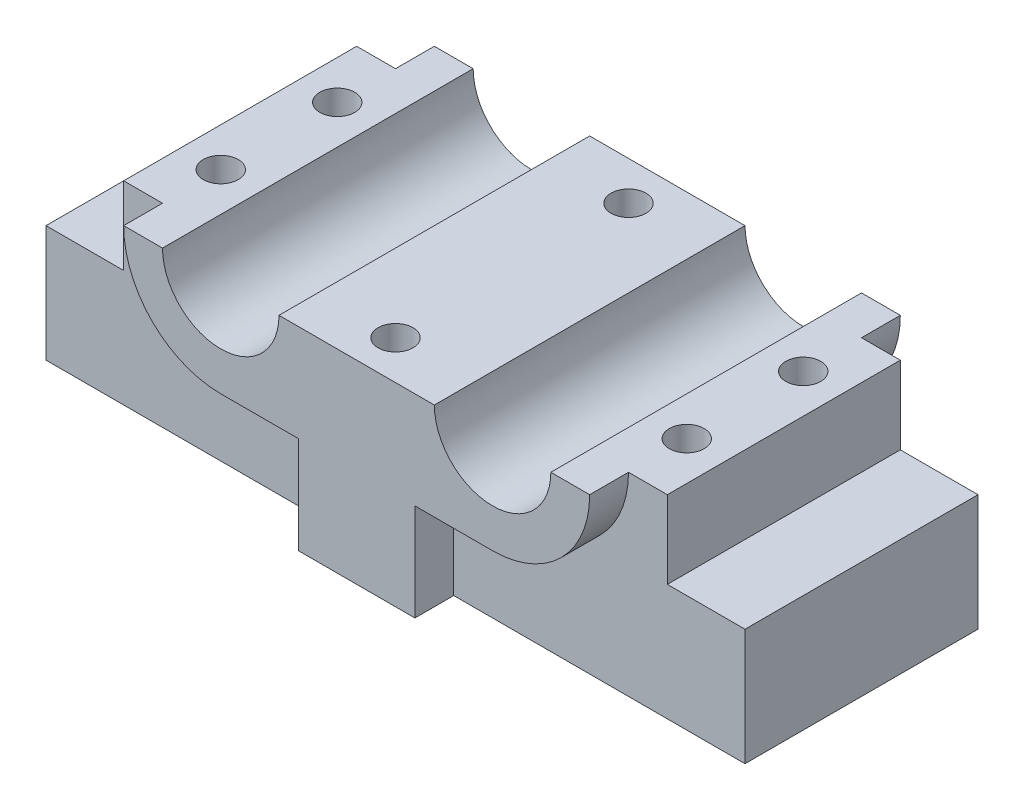
ISO-10303-21;
HEADER;
FILE_DESCRIPTION(('STEP AP214'),'2;1');
FILE_NAME('part.step','',(''),(''),'','','');
FILE_SCHEMA(('AUTOMOTIVE_DESIGN { 1 0 10303 214 1 1 1 1 }'));
ENDSEC;
DATA;
#1=APPLICATION_CONTEXT('core data for automotive mechanical design processes');
#2=APPLICATION_PROTOCOL_DEFINITION('international standard','automotive_design',2000,#1);
#3=PRODUCT_CONTEXT('',#1,'mechanical');
#4=PRODUCT('Part','Part','',(#3));
#5=PRODUCT_RELATED_PRODUCT_CATEGORY('part','',(#4));
#6=PRODUCT_DEFINITION_FORMATION('','',#4);
#7=PRODUCT_DEFINITION_CONTEXT('part definition',#1,'design');
#8=PRODUCT_DEFINITION('design','',#6,#7);
#9=PRODUCT_DEFINITION_SHAPE('','',#8);
#10=(LENGTH_UNIT() NAMED_UNIT(*) SI_UNIT(.MILLI.,.METRE.));
#11=(NAMED_UNIT(*) PLANE_ANGLE_UNIT() SI_UNIT($,.RADIAN.));
#12=(NAMED_UNIT(*) SI_UNIT($,.STERADIAN.) SOLID_ANGLE_UNIT());
#13=UNCERTAINTY_MEASURE_WITH_UNIT(LENGTH_MEASURE(1.E-05),#10,'distance_accuracy_value','');
#14=(GEOMETRIC_REPRESENTATION_CONTEXT(3) GLOBAL_UNCERTAINTY_ASSIGNED_CONTEXT((#13)) GLOBAL_UNIT_ASSIGNED_CONTEXT((#10,
#11,#12)) REPRESENTATION_CONTEXT('',''));
#15=CARTESIAN_POINT('',(0.,0.,0.));
#16=DIRECTION('',(0.,0.,1.));
#17=DIRECTION('',(1.,0.,0.));
#18=AXIS2_PLACEMENT_3D('',#15,#16,#17);
#19=CARTESIAN_POINT('',(-45.,12.5,20.));
#20=DIRECTION('',(0.,-1.,0.));
#21=DIRECTION('',(1.,0.,0.));
#22=AXIS2_PLACEMENT_3D('',#19,#20,#21);
#23=PLANE('',#22);
#24=CARTESIAN_POINT('',(-30.,12.5,-7.5));
#25=DIRECTION('',(0.,1.,0.));
#26=DIRECTION('',(0.,0.,1.));
#27=AXIS2_PLACEMENT_3D('',#24,#25,#26);
#28=CIRCLE('',#27,2.25000000000002);
#29=CARTESIAN_POINT('',(-30.,12.5,-5.24999999999998));
#30=VERTEX_POINT('',#29);
#31=EDGE_CURVE('E763',#30,#30,#28,.T.);
#32=ORIENTED_EDGE('',*,*,#31,.F.);
#33=EDGE_LOOP('',(#32));
#34=FACE_BOUND('',#33,.T.);
#35=DIRECTION('',(-1.,0.,0.));
#36=VECTOR('',#35,1.);
#37=CARTESIAN_POINT('',(-45.,12.5,20.));
#38=LINE('',#37,#36);
#39=CARTESIAN_POINT('',(-25.,12.5,20.));
#40=VERTEX_POINT('',#39);
#41=CARTESIAN_POINT('',(-30.,12.5,20.));
#42=VERTEX_POINT('',#41);
#43=EDGE_CURVE('E252',#40,#42,#38,.T.);
#44=ORIENTED_EDGE('',*,*,#43,.F.);
#45=DIRECTION('',(0.,0.,1.));
#46=VECTOR('',#45,1.);
#47=CARTESIAN_POINT('',(-25.,12.5,-20.001));
#48=LINE('',#47,#46);
#49=CARTESIAN_POINT('',(-25.,12.5,-20.));
#50=VERTEX_POINT('',#49);
#51=EDGE_CURVE('E54',#50,#40,#48,.T.);
#52=ORIENTED_EDGE('',*,*,#51,.F.);
#53=DIRECTION('',(-1.,0.,0.));
#54=VECTOR('',#53,1.);
#55=CARTESIAN_POINT('',(-45.,12.5,-20.));
#56=LINE('',#55,#54);
#57=CARTESIAN_POINT('',(-30.,12.5,-20.));
#58=VERTEX_POINT('',#57);
#59=EDGE_CURVE('E250',#50,#58,#56,.T.);
#60=ORIENTED_EDGE('',*,*,#59,.T.);
#61=DIRECTION('',(0.,0.,-1.));
#62=VECTOR('',#61,1.);
#63=CARTESIAN_POINT('',(-30.,12.5,-15.));
#64=LINE('',#63,#62);
#65=CARTESIAN_POINT('',(-30.,12.5,-15.));
#66=VERTEX_POINT('',#65);
#67=EDGE_CURVE('E354',#66,#58,#64,.T.);
#68=ORIENTED_EDGE('',*,*,#67,.F.);
#69=DIRECTION('',(-1.,0.,0.));
#70=VECTOR('',#69,1.);
#71=CARTESIAN_POINT('',(-35.,12.5,-15.));
#72=LINE('',#71,#70);
#73=CARTESIAN_POINT('',(-35.,12.5,-15.));
#74=VERTEX_POINT('',#73);
#75=EDGE_CURVE('E339',#66,#74,#72,.T.);
#76=ORIENTED_EDGE('',*,*,#75,.T.);
#77=DIRECTION('',(0.,0.,1.));
#78=VECTOR('',#77,1.);
#79=CARTESIAN_POINT('',(-35.,12.5,-20.));
#80=LINE('',#79,#78);
#81=CARTESIAN_POINT('',(-35.,12.5,15.));
#82=VERTEX_POINT('',#81);
#83=EDGE_CURVE('E274',#74,#82,#80,.T.);
#84=ORIENTED_EDGE('',*,*,#83,.T.);
#85=DIRECTION('',(-1.,0.,0.));
#86=VECTOR('',#85,1.);
#87=CARTESIAN_POINT('',(-35.,12.5,15.));
#88=LINE('',#87,#86);
#89=CARTESIAN_POINT('',(-30.,12.5,15.));
#90=VERTEX_POINT('',#89);
#91=EDGE_CURVE('E425',#90,#82,#88,.T.);
#92=ORIENTED_EDGE('',*,*,#91,.F.);
#93=DIRECTION('',(0.,0.,1.));
#94=VECTOR('',#93,1.);
#95=CARTESIAN_POINT('',(-30.,12.5,15.));
#96=LINE('',#95,#94);
#97=EDGE_CURVE('E327',#90,#42,#96,.T.);
#98=ORIENTED_EDGE('',*,*,#97,.T.);
#99=EDGE_LOOP('',(#44,#52,#60,#68,#76,#84,#92,#98));
#100=FACE_BOUND('',#99,.T.);
#101=CARTESIAN_POINT('',(-30.,12.5,7.5));
#102=DIRECTION('',(0.,1.,0.));
#103=DIRECTION('',(0.,0.,1.));
#104=AXIS2_PLACEMENT_3D('',#101,#102,#103);
#105=CIRCLE('',#104,2.25000000000002);
#106=CARTESIAN_POINT('',(-30.,12.5,9.75000000000002));
#107=VERTEX_POINT('',#106);
#108=EDGE_CURVE('E767',#107,#107,#105,.T.);
#109=ORIENTED_EDGE('',*,*,#108,.F.);
#110=EDGE_LOOP('',(#109));
#111=FACE_BOUND('',#110,.T.);
#112=ADVANCED_FACE('F39',(#34,#100,#111),#23,.F.);
#113=CARTESIAN_POINT('',(30.,12.5,-20.));
#114=VERTEX_POINT('',#113);
#115=CARTESIAN_POINT('',(25.,12.5,-20.));
#116=VERTEX_POINT('',#115);
#117=EDGE_CURVE('E237',#114,#116,#56,.T.);
#118=ORIENTED_EDGE('',*,*,#117,.T.);
#119=DIRECTION('',(0.,0.,1.));
#120=VECTOR('',#119,1.);
#121=CARTESIAN_POINT('',(25.,12.5,-20.001));
#122=LINE('',#121,#120);
#123=CARTESIAN_POINT('',(25.,12.5,20.));
#124=VERTEX_POINT('',#123);
#125=EDGE_CURVE('E222',#116,#124,#122,.T.);
#126=ORIENTED_EDGE('',*,*,#125,.T.);
#127=CARTESIAN_POINT('',(30.,12.5,20.));
#128=VERTEX_POINT('',#127);
#129=EDGE_CURVE('E281',#128,#124,#38,.T.);
#130=ORIENTED_EDGE('',*,*,#129,.F.);
#131=DIRECTION('',(0.,0.,1.));
#132=VECTOR('',#131,1.);
#133=CARTESIAN_POINT('',(30.,12.5,15.));
#134=LINE('',#133,#132);
#135=CARTESIAN_POINT('',(30.,12.5,15.));
#136=VERTEX_POINT('',#135);
#137=EDGE_CURVE('E280',#136,#128,#134,.T.);
#138=ORIENTED_EDGE('',*,*,#137,.F.);
#139=DIRECTION('',(-1.,0.,0.));
#140=VECTOR('',#139,1.);
#141=CARTESIAN_POINT('',(35.,12.5,15.));
#142=LINE('',#141,#140);
#143=CARTESIAN_POINT('',(35.,12.5,15.));
#144=VERTEX_POINT('',#143);
#145=EDGE_CURVE('E388',#144,#136,#142,.T.);
#146=ORIENTED_EDGE('',*,*,#145,.F.);
#147=DIRECTION('',(0.,0.,1.));
#148=VECTOR('',#147,1.);
#149=CARTESIAN_POINT('',(35.,12.5,-20.));
#150=LINE('',#149,#148);
#151=CARTESIAN_POINT('',(35.,12.5,-15.));
#152=VERTEX_POINT('',#151);
#153=EDGE_CURVE('E267',#152,#144,#150,.T.);
#154=ORIENTED_EDGE('',*,*,#153,.F.);
#155=DIRECTION('',(-1.,0.,0.));
#156=VECTOR('',#155,1.);
#157=CARTESIAN_POINT('',(35.,12.5,-15.));
#158=LINE('',#157,#156);
#159=CARTESIAN_POINT('',(30.,12.5,-15.));
#160=VERTEX_POINT('',#159);
#161=EDGE_CURVE('E497',#152,#160,#158,.T.);
#162=ORIENTED_EDGE('',*,*,#161,.T.);
#163=DIRECTION('',(0.,0.,-1.));
#164=VECTOR('',#163,1.);
#165=CARTESIAN_POINT('',(30.,12.5,-15.));
#166=LINE('',#165,#164);
#167=EDGE_CURVE('E247',#160,#114,#166,.T.);
#168=ORIENTED_EDGE('',*,*,#167,.T.);
#169=EDGE_LOOP('',(#118,#126,#130,#138,#146,#154,#162,#168));
#170=FACE_BOUND('',#169,.T.);
#171=CARTESIAN_POINT('',(30.,12.5,7.5));
#172=DIRECTION('',(0.,1.,0.));
#173=DIRECTION('',(0.,0.,1.));
#174=AXIS2_PLACEMENT_3D('',#171,#172,#173);
#175=CIRCLE('',#174,2.25000000000002);
#176=CARTESIAN_POINT('',(30.,12.5,9.75000000000002));
#177=VERTEX_POINT('',#176);
#178=EDGE_CURVE('E621',#177,#177,#175,.T.);
#179=ORIENTED_EDGE('',*,*,#178,.F.);
#180=EDGE_LOOP('',(#179));
#181=FACE_BOUND('',#180,.T.);
#182=CARTESIAN_POINT('',(30.,12.5,-7.5));
#183=DIRECTION('',(0.,1.,0.));
#184=DIRECTION('',(0.,0.,1.));
#185=AXIS2_PLACEMENT_3D('',#182,#183,#184);
#186=CIRCLE('',#185,2.25000000000001);
#187=CARTESIAN_POINT('',(30.,12.5,-5.24999999999999));
#188=VERTEX_POINT('',#187);
#189=EDGE_CURVE('E771',#188,#188,#186,.T.);
#190=ORIENTED_EDGE('',*,*,#189,.F.);
#191=EDGE_LOOP('',(#190));
#192=FACE_BOUND('',#191,.T.);
#193=ADVANCED_FACE('F244',(#170,#181,#192),#23,.F.);
#194=CARTESIAN_POINT('',(0.,12.5,-15.));
#195=DIRECTION('',(0.,1.,0.));
#196=DIRECTION('',(0.,0.,1.));
#197=AXIS2_PLACEMENT_3D('',#194,#195,#196);
#198=CIRCLE('',#197,2.25000000000001);
#199=CARTESIAN_POINT('',(0.,12.5,-12.75));
#200=VERTEX_POINT('',#199);
#201=EDGE_CURVE('E528',#200,#200,#198,.T.);
#202=ORIENTED_EDGE('',*,*,#201,.F.);
#203=EDGE_LOOP('',(#202));
#204=FACE_BOUND('',#203,.T.);
#205=CARTESIAN_POINT('',(0.,12.5,15.));
#206=DIRECTION('',(0.,1.,0.));
#207=DIRECTION('',(0.,0.,1.));
#208=AXIS2_PLACEMENT_3D('',#205,#206,#207);
#209=CIRCLE('',#208,2.25000000000001);
#210=CARTESIAN_POINT('',(0.,12.5,17.25));
#211=VERTEX_POINT('',#210);
#212=EDGE_CURVE('E532',#211,#211,#209,.T.);
#213=ORIENTED_EDGE('',*,*,#212,.F.);
#214=EDGE_LOOP('',(#213));
#215=FACE_BOUND('',#214,.T.);
#216=CARTESIAN_POINT('',(9.99999999999999,12.5,20.));
#217=VERTEX_POINT('',#216);
#218=CARTESIAN_POINT('',(-10.,12.5,20.));
#219=VERTEX_POINT('',#218);
#220=EDGE_CURVE('E283',#217,#219,#38,.T.);
#221=ORIENTED_EDGE('',*,*,#220,.F.);
#222=DIRECTION('',(0.,0.,1.));
#223=VECTOR('',#222,1.);
#224=CARTESIAN_POINT('',(10.,12.5,-20.001));
#225=LINE('',#224,#223);
#226=CARTESIAN_POINT('',(10.,12.5,-20.));
#227=VERTEX_POINT('',#226);
#228=EDGE_CURVE('E62',#227,#217,#225,.T.);
#229=ORIENTED_EDGE('',*,*,#228,.F.);
#230=CARTESIAN_POINT('',(-10.,12.5,-20.));
#231=VERTEX_POINT('',#230);
#232=EDGE_CURVE('E240',#227,#231,#56,.T.);
#233=ORIENTED_EDGE('',*,*,#232,.T.);
#234=DIRECTION('',(0.,0.,1.));
#235=VECTOR('',#234,1.);
#236=CARTESIAN_POINT('',(-10.,12.5,-20.001));
#237=LINE('',#236,#235);
#238=EDGE_CURVE('E536',#231,#219,#237,.T.);
#239=ORIENTED_EDGE('',*,*,#238,.T.);
#240=EDGE_LOOP('',(#221,#229,#233,#239));
#241=FACE_BOUND('',#240,.T.);
#242=ADVANCED_FACE('F511',(#204,#215,#241),#23,.F.);
#243=CARTESIAN_POINT('',(-45.,12.5,20.));
#244=DIRECTION('',(1.,0.,0.));
#245=DIRECTION('',(0.,0.,-1.));
#246=AXIS2_PLACEMENT_3D('',#243,#244,#245);
#247=PLANE('',#246);
#248=DIRECTION('',(0.,-1.,0.));
#249=VECTOR('',#248,1.);
#250=CARTESIAN_POINT('',(-45.,-12.5,-15.));
#251=LINE('',#250,#249);
#252=CARTESIAN_POINT('',(-45.,2.5,-15.));
#253=VERTEX_POINT('',#252);
#254=CARTESIAN_POINT('',(-45.,-12.5,-15.));
#255=VERTEX_POINT('',#254);
#256=EDGE_CURVE('E351',#253,#255,#251,.T.);
#257=ORIENTED_EDGE('',*,*,#256,.T.);
#258=DIRECTION('',(0.,0.,-1.));
#259=VECTOR('',#258,1.);
#260=CARTESIAN_POINT('',(-45.,-12.5,20.));
#261=LINE('',#260,#259);
#262=CARTESIAN_POINT('',(-45.,-12.5,15.));
#263=VERTEX_POINT('',#262);
#264=EDGE_CURVE('E11',#263,#255,#261,.T.);
#265=ORIENTED_EDGE('',*,*,#264,.F.);
#266=DIRECTION('',(0.,-1.,0.));
#267=VECTOR('',#266,1.);
#268=CARTESIAN_POINT('',(-45.,-12.5,15.));
#269=LINE('',#268,#267);
#270=CARTESIAN_POINT('',(-45.,2.5,15.));
#271=VERTEX_POINT('',#270);
#272=EDGE_CURVE('E439',#271,#263,#269,.T.);
#273=ORIENTED_EDGE('',*,*,#272,.F.);
#274=DIRECTION('',(0.,0.,1.));
#275=VECTOR('',#274,1.);
#276=CARTESIAN_POINT('',(-45.,2.49999999999999,-20.));
#277=LINE('',#276,#275);
#278=EDGE_CURVE('E276',#253,#271,#277,.T.);
#279=ORIENTED_EDGE('',*,*,#278,.F.);
#280=EDGE_LOOP('',(#257,#265,#273,#279));
#281=FACE_BOUND('',#280,.T.);
#282=ADVANCED_FACE('F452',(#281),#247,.F.);
#283=CARTESIAN_POINT('',(-35.,12.5,-20.));
#284=DIRECTION('',(1.,0.,0.));
#285=DIRECTION('',(0.,0.,-1.));
#286=AXIS2_PLACEMENT_3D('',#283,#284,#285);
#287=PLANE('',#286);
#288=DIRECTION('',(0.,-1.,0.));
#289=VECTOR('',#288,1.);
#290=CARTESIAN_POINT('',(-35.,2.5,-15.));
#291=LINE('',#290,#289);
#292=CARTESIAN_POINT('',(-35.,2.5,-15.));
#293=VERTEX_POINT('',#292);
#294=EDGE_CURVE('E335',#74,#293,#291,.T.);
#295=ORIENTED_EDGE('',*,*,#294,.T.);
#296=DIRECTION('',(0.,0.,1.));
#297=VECTOR('',#296,1.);
#298=CARTESIAN_POINT('',(-35.,2.49999999999999,-20.));
#299=LINE('',#298,#297);
#300=CARTESIAN_POINT('',(-35.,2.49999999999999,15.));
#301=VERTEX_POINT('',#300);
#302=EDGE_CURVE('E278',#293,#301,#299,.T.);
#303=ORIENTED_EDGE('',*,*,#302,.T.);
#304=DIRECTION('',(0.,-1.,0.));
#305=VECTOR('',#304,1.);
#306=CARTESIAN_POINT('',(-35.,2.5,15.));
#307=LINE('',#306,#305);
#308=EDGE_CURVE('E408',#82,#301,#307,.T.);
#309=ORIENTED_EDGE('',*,*,#308,.F.);
#310=ORIENTED_EDGE('',*,*,#83,.F.);
#311=EDGE_LOOP('',(#295,#303,#309,#310));
#312=FACE_BOUND('',#311,.T.);
#313=ADVANCED_FACE('F470',(#312),#287,.F.);
#314=CARTESIAN_POINT('',(-35.,2.49999999999999,-20.));
#315=DIRECTION('',(0.,-1.,0.));
#316=DIRECTION('',(1.,0.,0.));
#317=AXIS2_PLACEMENT_3D('',#314,#315,#316);
#318=PLANE('',#317);
#319=DIRECTION('',(-1.,0.,0.));
#320=VECTOR('',#319,1.);
#321=CARTESIAN_POINT('',(-45.,2.5,-15.));
#322=LINE('',#321,#320);
#323=EDGE_CURVE('E332',#293,#253,#322,.T.);
#324=ORIENTED_EDGE('',*,*,#323,.T.);
#325=ORIENTED_EDGE('',*,*,#278,.T.);
#326=DIRECTION('',(-1.,0.,0.));
#327=VECTOR('',#326,1.);
#328=CARTESIAN_POINT('',(-45.,2.5,15.));
#329=LINE('',#328,#327);
#330=EDGE_CURVE('E270',#301,#271,#329,.T.);
#331=ORIENTED_EDGE('',*,*,#330,.F.);
#332=ORIENTED_EDGE('',*,*,#302,.F.);
#333=EDGE_LOOP('',(#324,#325,#331,#332));
#334=FACE_BOUND('',#333,.T.);
#335=ADVANCED_FACE('F471',(#334),#318,.F.);
#336=CARTESIAN_POINT('',(-45.,-12.5,20.));
#337=DIRECTION('',(0.,1.,0.));
#338=DIRECTION('',(0.,0.,1.));
#339=AXIS2_PLACEMENT_3D('',#336,#337,#338);
#340=PLANE('',#339);
#341=CARTESIAN_POINT('',(0.,-12.5,-15.));
#342=DIRECTION('',(0.,1.,0.));
#343=DIRECTION('',(0.,0.,1.));
#344=AXIS2_PLACEMENT_3D('',#341,#342,#343);
#345=CIRCLE('',#344,2.25000000000001);
#346=CARTESIAN_POINT('',(0.,-12.5,-12.75));
#347=VERTEX_POINT('',#346);
#348=EDGE_CURVE('E601',#347,#347,#345,.T.);
#349=ORIENTED_EDGE('',*,*,#348,.T.);
#350=EDGE_LOOP('',(#349));
#351=FACE_BOUND('',#350,.T.);
#352=CARTESIAN_POINT('',(0.,-12.5,15.));
#353=DIRECTION('',(0.,1.,0.));
#354=DIRECTION('',(0.,0.,1.));
#355=AXIS2_PLACEMENT_3D('',#352,#353,#354);
#356=CIRCLE('',#355,2.25000000000001);
#357=CARTESIAN_POINT('',(0.,-12.5,17.25));
#358=VERTEX_POINT('',#357);
#359=EDGE_CURVE('E605',#358,#358,#356,.T.);
#360=ORIENTED_EDGE('',*,*,#359,.T.);
#361=EDGE_LOOP('',(#360));
#362=FACE_BOUND('',#361,.T.);
#363=CARTESIAN_POINT('',(-30.,-12.5,-7.5));
#364=DIRECTION('',(0.,1.,0.));
#365=DIRECTION('',(0.,0.,1.));
#366=AXIS2_PLACEMENT_3D('',#363,#364,#365);
#367=CIRCLE('',#366,2.25000000000001);
#368=CARTESIAN_POINT('',(-30.,-12.5,-5.24999999999999));
#369=VERTEX_POINT('',#368);
#370=EDGE_CURVE('E609',#369,#369,#367,.T.);
#371=ORIENTED_EDGE('',*,*,#370,.T.);
#372=EDGE_LOOP('',(#371));
#373=FACE_BOUND('',#372,.T.);
#374=CARTESIAN_POINT('',(-30.,-12.5,7.5));
#375=DIRECTION('',(0.,1.,0.));
#376=DIRECTION('',(0.,0.,1.));
#377=AXIS2_PLACEMENT_3D('',#374,#375,#376);
#378=CIRCLE('',#377,2.25000000000001);
#379=CARTESIAN_POINT('',(-30.,-12.5,9.75000000000001));
#380=VERTEX_POINT('',#379);
#381=EDGE_CURVE('E613',#380,#380,#378,.T.);
#382=ORIENTED_EDGE('',*,*,#381,.T.);
#383=EDGE_LOOP('',(#382));
#384=FACE_BOUND('',#383,.T.);
#385=CARTESIAN_POINT('',(30.,-12.5,-7.5));
#386=DIRECTION('',(0.,1.,0.));
#387=DIRECTION('',(0.,0.,1.));
#388=AXIS2_PLACEMENT_3D('',#385,#386,#387);
#389=CIRCLE('',#388,2.25000000000001);
#390=CARTESIAN_POINT('',(30.,-12.5,-5.24999999999999));
#391=VERTEX_POINT('',#390);
#392=EDGE_CURVE('E617',#391,#391,#389,.T.);
#393=ORIENTED_EDGE('',*,*,#392,.T.);
#394=EDGE_LOOP('',(#393));
#395=FACE_BOUND('',#394,.T.);
#396=CARTESIAN_POINT('',(30.,-12.5,7.5));
#397=DIRECTION('',(0.,1.,0.));
#398=DIRECTION('',(0.,0.,1.));
#399=AXIS2_PLACEMENT_3D('',#396,#397,#398);
#400=CIRCLE('',#399,2.25000000000001);
#401=CARTESIAN_POINT('',(30.,-12.5,9.75000000000001));
#402=VERTEX_POINT('',#401);
#403=EDGE_CURVE('E539',#402,#402,#400,.T.);
#404=ORIENTED_EDGE('',*,*,#403,.T.);
#405=EDGE_LOOP('',(#404));
#406=FACE_BOUND('',#405,.T.);
#407=DIRECTION('',(0.,0.,-1.));
#408=VECTOR('',#407,1.);
#409=CARTESIAN_POINT('',(7.5,-12.5,-15.));
#410=LINE('',#409,#408);
#411=CARTESIAN_POINT('',(7.5,-12.5,-15.));
#412=VERTEX_POINT('',#411);
#413=CARTESIAN_POINT('',(7.5,-12.5,-20.));
#414=VERTEX_POINT('',#413);
#415=EDGE_CURVE('E302',#412,#414,#410,.T.);
#416=ORIENTED_EDGE('',*,*,#415,.F.);
#417=DIRECTION('',(1.,0.,0.));
#418=VECTOR('',#417,1.);
#419=CARTESIAN_POINT('',(7.5,-12.5,-15.));
#420=LINE('',#419,#418);
#421=CARTESIAN_POINT('',(45.,-12.5,-15.));
#422=VERTEX_POINT('',#421);
#423=EDGE_CURVE('E301',#412,#422,#420,.T.);
#424=ORIENTED_EDGE('',*,*,#423,.T.);
#425=DIRECTION('',(0.,0.,-1.));
#426=VECTOR('',#425,1.);
#427=CARTESIAN_POINT('',(45.,-12.5,20.));
#428=LINE('',#427,#426);
#429=CARTESIAN_POINT('',(45.,-12.5,15.));
#430=VERTEX_POINT('',#429);
#431=EDGE_CURVE('E47',#430,#422,#428,.T.);
#432=ORIENTED_EDGE('',*,*,#431,.F.);
#433=DIRECTION('',(1.,0.,0.));
#434=VECTOR('',#433,1.);
#435=CARTESIAN_POINT('',(7.5,-12.5,15.));
#436=LINE('',#435,#434);
#437=CARTESIAN_POINT('',(7.5,-12.5,15.));
#438=VERTEX_POINT('',#437);
#439=EDGE_CURVE('E299',#438,#430,#436,.T.);
#440=ORIENTED_EDGE('',*,*,#439,.F.);
#441=DIRECTION('',(0.,0.,1.));
#442=VECTOR('',#441,1.);
#443=CARTESIAN_POINT('',(7.5,-12.5,15.));
#444=LINE('',#443,#442);
#445=CARTESIAN_POINT('',(7.5,-12.5,20.));
#446=VERTEX_POINT('',#445);
#447=EDGE_CURVE('E401',#438,#446,#444,.T.);
#448=ORIENTED_EDGE('',*,*,#447,.T.);
#449=DIRECTION('',(1.,0.,0.));
#450=VECTOR('',#449,1.);
#451=CARTESIAN_POINT('',(-45.,-12.5,20.));
#452=LINE('',#451,#450);
#453=CARTESIAN_POINT('',(-7.5,-12.5,20.));
#454=VERTEX_POINT('',#453);
#455=EDGE_CURVE('E282',#454,#446,#452,.T.);
#456=ORIENTED_EDGE('',*,*,#455,.F.);
#457=DIRECTION('',(0.,0.,1.));
#458=VECTOR('',#457,1.);
#459=CARTESIAN_POINT('',(-7.5,-12.5,15.));
#460=LINE('',#459,#458);
#461=CARTESIAN_POINT('',(-7.5,-12.5,15.));
#462=VERTEX_POINT('',#461);
#463=EDGE_CURVE('E406',#462,#454,#460,.T.);
#464=ORIENTED_EDGE('',*,*,#463,.F.);
#465=DIRECTION('',(1.,0.,0.));
#466=VECTOR('',#465,1.);
#467=CARTESIAN_POINT('',(-7.5,-12.5,15.));
#468=LINE('',#467,#466);
#469=EDGE_CURVE('E437',#263,#462,#468,.T.);
#470=ORIENTED_EDGE('',*,*,#469,.F.);
#471=ORIENTED_EDGE('',*,*,#264,.T.);
#472=DIRECTION('',(1.,0.,0.));
#473=VECTOR('',#472,1.);
#474=CARTESIAN_POINT('',(-7.5,-12.5,-15.));
#475=LINE('',#474,#473);
#476=CARTESIAN_POINT('',(-7.5,-12.5,-15.));
#477=VERTEX_POINT('',#476);
#478=EDGE_CURVE('E348',#255,#477,#475,.T.);
#479=ORIENTED_EDGE('',*,*,#478,.T.);
#480=DIRECTION('',(0.,0.,-1.));
#481=VECTOR('',#480,1.);
#482=CARTESIAN_POINT('',(-7.5,-12.5,-15.));
#483=LINE('',#482,#481);
#484=CARTESIAN_POINT('',(-7.5,-12.5,-20.));
#485=VERTEX_POINT('',#484);
#486=EDGE_CURVE('E317',#477,#485,#483,.T.);
#487=ORIENTED_EDGE('',*,*,#486,.T.);
#488=DIRECTION('',(1.,0.,0.));
#489=VECTOR('',#488,1.);
#490=CARTESIAN_POINT('',(-45.,-12.5,-20.));
#491=LINE('',#490,#489);
#492=EDGE_CURVE('E248',#485,#414,#491,.T.);
#493=ORIENTED_EDGE('',*,*,#492,.T.);
#494=EDGE_LOOP('',(#416,#424,#432,#440,#448,#456,#464,#470,#471,#479,#487,#493));
#495=FACE_BOUND('',#494,.T.);
#496=ADVANCED_FACE('F297',(#351,#362,#373,#384,#395,#406,#495),#340,.F.);
#497=CARTESIAN_POINT('',(0.,0.,-20.));
#498=DIRECTION('',(0.,0.,1.));
#499=DIRECTION('',(1.,0.,0.));
#500=AXIS2_PLACEMENT_3D('',#497,#498,#499);
#501=PLANE('',#500);
#502=ORIENTED_EDGE('',*,*,#232,.F.);
#503=CARTESIAN_POINT('',(17.5,12.5,-20.));
#504=DIRECTION('',(0.,0.,1.));
#505=DIRECTION('',(1.,0.,0.));
#506=AXIS2_PLACEMENT_3D('',#503,#504,#505);
#507=CIRCLE('',#506,7.5);
#508=EDGE_CURVE('E225',#116,#227,#507,.F.);
#509=ORIENTED_EDGE('',*,*,#508,.F.);
#510=ORIENTED_EDGE('',*,*,#117,.F.);
#511=CARTESIAN_POINT('',(17.5,12.5,-20.));
#512=DIRECTION('',(0.,0.,-1.));
#513=DIRECTION('',(-1.,0.,0.));
#514=AXIS2_PLACEMENT_3D('',#511,#512,#513);
#515=CIRCLE('',#514,12.5);
#516=CARTESIAN_POINT('',(17.5,0.,-20.));
#517=VERTEX_POINT('',#516);
#518=EDGE_CURVE('E314',#114,#517,#515,.T.);
#519=ORIENTED_EDGE('',*,*,#518,.T.);
#520=DIRECTION('',(-1.,0.,0.));
#521=VECTOR('',#520,1.);
#522=CARTESIAN_POINT('',(17.5,0.,-20.));
#523=LINE('',#522,#521);
#524=CARTESIAN_POINT('',(7.5,0.,-20.));
#525=VERTEX_POINT('',#524);
#526=EDGE_CURVE('E320',#517,#525,#523,.T.);
#527=ORIENTED_EDGE('',*,*,#526,.T.);
#528=DIRECTION('',(0.,-1.,0.));
#529=VECTOR('',#528,1.);
#530=CARTESIAN_POINT('',(7.5,0.,-20.));
#531=LINE('',#530,#529);
#532=EDGE_CURVE('E316',#525,#414,#531,.T.);
#533=ORIENTED_EDGE('',*,*,#532,.T.);
#534=ORIENTED_EDGE('',*,*,#492,.F.);
#535=DIRECTION('',(0.,1.,0.));
#536=VECTOR('',#535,1.);
#537=CARTESIAN_POINT('',(-7.5,0.,-20.));
#538=LINE('',#537,#536);
#539=CARTESIAN_POINT('',(-7.5,0.,-20.));
#540=VERTEX_POINT('',#539);
#541=EDGE_CURVE('E336',#485,#540,#538,.T.);
#542=ORIENTED_EDGE('',*,*,#541,.T.);
#543=DIRECTION('',(-1.,0.,0.));
#544=VECTOR('',#543,1.);
#545=CARTESIAN_POINT('',(-17.5,0.,-20.));
#546=LINE('',#545,#544);
#547=CARTESIAN_POINT('',(-17.5,0.,-20.));
#548=VERTEX_POINT('',#547);
#549=EDGE_CURVE('E358',#540,#548,#546,.T.);
#550=ORIENTED_EDGE('',*,*,#549,.T.);
#551=CARTESIAN_POINT('',(-17.5,12.5,-20.));
#552=DIRECTION('',(0.,0.,-1.));
#553=DIRECTION('',(1.,0.,0.));
#554=AXIS2_PLACEMENT_3D('',#551,#552,#553);
#555=CIRCLE('',#554,12.5);
#556=EDGE_CURVE('E355',#548,#58,#555,.T.);
#557=ORIENTED_EDGE('',*,*,#556,.T.);
#558=ORIENTED_EDGE('',*,*,#59,.F.);
#559=CARTESIAN_POINT('',(-17.5,12.5,-20.));
#560=DIRECTION('',(0.,0.,1.));
#561=DIRECTION('',(1.,0.,0.));
#562=AXIS2_PLACEMENT_3D('',#559,#560,#561);
#563=CIRCLE('',#562,7.5);
#564=EDGE_CURVE('E241',#231,#50,#563,.F.);
#565=ORIENTED_EDGE('',*,*,#564,.F.);
#566=EDGE_LOOP('',(#502,#509,#510,#519,#527,#533,#534,#542,#550,#557,#558,#565));
#567=FACE_BOUND('',#566,.T.);
#568=ADVANCED_FACE('F235',(#567),#501,.F.);
#569=CARTESIAN_POINT('',(45.,12.5,20.));
#570=DIRECTION('',(-1.,0.,0.));
#571=DIRECTION('',(0.,-1.,0.));
#572=AXIS2_PLACEMENT_3D('',#569,#570,#571);
#573=PLANE('',#572);
#574=ORIENTED_EDGE('',*,*,#431,.T.);
#575=DIRECTION('',(0.,1.,0.));
#576=VECTOR('',#575,1.);
#577=CARTESIAN_POINT('',(45.,-12.5,-15.));
#578=LINE('',#577,#576);
#579=CARTESIAN_POINT('',(45.,2.5,-15.));
#580=VERTEX_POINT('',#579);
#581=EDGE_CURVE('E291',#422,#580,#578,.T.);
#582=ORIENTED_EDGE('',*,*,#581,.T.);
#583=DIRECTION('',(0.,0.,1.));
#584=VECTOR('',#583,1.);
#585=CARTESIAN_POINT('',(45.,2.5,-20.));
#586=LINE('',#585,#584);
#587=CARTESIAN_POINT('',(45.,2.5,15.));
#588=VERTEX_POINT('',#587);
#589=EDGE_CURVE('E255',#580,#588,#586,.T.);
#590=ORIENTED_EDGE('',*,*,#589,.T.);
#591=DIRECTION('',(0.,1.,0.));
#592=VECTOR('',#591,1.);
#593=CARTESIAN_POINT('',(45.,-12.5,15.));
#594=LINE('',#593,#592);
#595=EDGE_CURVE('E292',#430,#588,#594,.T.);
#596=ORIENTED_EDGE('',*,*,#595,.F.);
#597=EDGE_LOOP('',(#574,#582,#590,#596));
#598=FACE_BOUND('',#597,.T.);
#599=ADVANCED_FACE('F41',(#598),#573,.F.);
#600=CARTESIAN_POINT('',(0.,0.,20.));
#601=DIRECTION('',(0.,0.,1.));
#602=DIRECTION('',(1.,0.,0.));
#603=AXIS2_PLACEMENT_3D('',#600,#601,#602);
#604=PLANE('',#603);
#605=CARTESIAN_POINT('',(17.5,12.5,20.));
#606=DIRECTION('',(0.,0.,1.));
#607=DIRECTION('',(-1.,0.,0.));
#608=AXIS2_PLACEMENT_3D('',#605,#606,#607);
#609=CIRCLE('',#608,7.5);
#610=EDGE_CURVE('E226',#217,#124,#609,.T.);
#611=ORIENTED_EDGE('',*,*,#610,.F.);
#612=ORIENTED_EDGE('',*,*,#220,.T.);
#613=CARTESIAN_POINT('',(-17.5,12.5,20.));
#614=DIRECTION('',(0.,0.,1.));
#615=DIRECTION('',(1.,0.,0.));
#616=AXIS2_PLACEMENT_3D('',#613,#614,#615);
#617=CIRCLE('',#616,7.5);
#618=EDGE_CURVE('E538',#40,#219,#617,.T.);
#619=ORIENTED_EDGE('',*,*,#618,.F.);
#620=ORIENTED_EDGE('',*,*,#43,.T.);
#621=CARTESIAN_POINT('',(-17.5,12.5,20.));
#622=DIRECTION('',(0.,0.,-1.));
#623=DIRECTION('',(1.,0.,0.));
#624=AXIS2_PLACEMENT_3D('',#621,#622,#623);
#625=CIRCLE('',#624,12.5);
#626=CARTESIAN_POINT('',(-17.5,0.,20.));
#627=VERTEX_POINT('',#626);
#628=EDGE_CURVE('E415',#627,#42,#625,.T.);
#629=ORIENTED_EDGE('',*,*,#628,.F.);
#630=DIRECTION('',(-1.,0.,0.));
#631=VECTOR('',#630,1.);
#632=CARTESIAN_POINT('',(-17.5,0.,20.));
#633=LINE('',#632,#631);
#634=CARTESIAN_POINT('',(-7.5,0.,20.));
#635=VERTEX_POINT('',#634);
#636=EDGE_CURVE('E418',#635,#627,#633,.T.);
#637=ORIENTED_EDGE('',*,*,#636,.F.);
#638=DIRECTION('',(0.,1.,0.));
#639=VECTOR('',#638,1.);
#640=CARTESIAN_POINT('',(-7.5,0.,20.));
#641=LINE('',#640,#639);
#642=EDGE_CURVE('E396',#454,#635,#641,.T.);
#643=ORIENTED_EDGE('',*,*,#642,.F.);
#644=ORIENTED_EDGE('',*,*,#455,.T.);
#645=DIRECTION('',(0.,-1.,0.));
#646=VECTOR('',#645,1.);
#647=CARTESIAN_POINT('',(7.5,0.,20.));
#648=LINE('',#647,#646);
#649=CARTESIAN_POINT('',(7.5,0.,20.));
#650=VERTEX_POINT('',#649);
#651=EDGE_CURVE('E374',#650,#446,#648,.T.);
#652=ORIENTED_EDGE('',*,*,#651,.F.);
#653=DIRECTION('',(-1.,0.,0.));
#654=VECTOR('',#653,1.);
#655=CARTESIAN_POINT('',(17.5,0.,20.));
#656=LINE('',#655,#654);
#657=CARTESIAN_POINT('',(17.5,0.,20.));
#658=VERTEX_POINT('',#657);
#659=EDGE_CURVE('E395',#658,#650,#656,.T.);
#660=ORIENTED_EDGE('',*,*,#659,.F.);
#661=CARTESIAN_POINT('',(17.5,12.5,20.));
#662=DIRECTION('',(0.,0.,-1.));
#663=DIRECTION('',(-1.,0.,0.));
#664=AXIS2_PLACEMENT_3D('',#661,#662,#663);
#665=CIRCLE('',#664,12.5);
#666=EDGE_CURVE('E392',#128,#658,#665,.T.);
#667=ORIENTED_EDGE('',*,*,#666,.F.);
#668=ORIENTED_EDGE('',*,*,#129,.T.);
#669=EDGE_LOOP('',(#611,#612,#619,#620,#629,#637,#643,#644,#652,#660,#667,#668));
#670=FACE_BOUND('',#669,.T.);
#671=ADVANCED_FACE('F537',(#670),#604,.T.);
#672=CARTESIAN_POINT('',(45.,2.5,-20.));
#673=DIRECTION('',(0.,-1.,0.));
#674=DIRECTION('',(1.,0.,0.));
#675=AXIS2_PLACEMENT_3D('',#672,#673,#674);
#676=PLANE('',#675);
#677=ORIENTED_EDGE('',*,*,#589,.F.);
#678=DIRECTION('',(-1.,0.,0.));
#679=VECTOR('',#678,1.);
#680=CARTESIAN_POINT('',(45.,2.5,-15.));
#681=LINE('',#680,#679);
#682=CARTESIAN_POINT('',(35.,2.5,-15.));
#683=VERTEX_POINT('',#682);
#684=EDGE_CURVE('E309',#580,#683,#681,.T.);
#685=ORIENTED_EDGE('',*,*,#684,.T.);
#686=DIRECTION('',(0.,0.,1.));
#687=VECTOR('',#686,1.);
#688=CARTESIAN_POINT('',(35.,2.5,-20.));
#689=LINE('',#688,#687);
#690=CARTESIAN_POINT('',(35.,2.5,15.));
#691=VERTEX_POINT('',#690);
#692=EDGE_CURVE('E260',#683,#691,#689,.T.);
#693=ORIENTED_EDGE('',*,*,#692,.T.);
#694=DIRECTION('',(-1.,0.,0.));
#695=VECTOR('',#694,1.);
#696=CARTESIAN_POINT('',(45.,2.5,15.));
#697=LINE('',#696,#695);
#698=EDGE_CURVE('E382',#588,#691,#697,.T.);
#699=ORIENTED_EDGE('',*,*,#698,.F.);
#700=EDGE_LOOP('',(#677,#685,#693,#699));
#701=FACE_BOUND('',#700,.T.);
#702=ADVANCED_FACE('F579',(#701),#676,.F.);
#703=CARTESIAN_POINT('',(35.,12.5,-20.));
#704=DIRECTION('',(-1.,0.,0.));
#705=DIRECTION('',(0.,0.,1.));
#706=AXIS2_PLACEMENT_3D('',#703,#704,#705);
#707=PLANE('',#706);
#708=ORIENTED_EDGE('',*,*,#692,.F.);
#709=DIRECTION('',(0.,1.,0.));
#710=VECTOR('',#709,1.);
#711=CARTESIAN_POINT('',(35.,2.5,-15.));
#712=LINE('',#711,#710);
#713=EDGE_CURVE('E633',#683,#152,#712,.T.);
#714=ORIENTED_EDGE('',*,*,#713,.T.);
#715=ORIENTED_EDGE('',*,*,#153,.T.);
#716=DIRECTION('',(0.,1.,0.));
#717=VECTOR('',#716,1.);
#718=CARTESIAN_POINT('',(35.,2.5,15.));
#719=LINE('',#718,#717);
#720=EDGE_CURVE('E385',#691,#144,#719,.T.);
#721=ORIENTED_EDGE('',*,*,#720,.F.);
#722=EDGE_LOOP('',(#708,#714,#715,#721));
#723=FACE_BOUND('',#722,.T.);
#724=ADVANCED_FACE('F569',(#723),#707,.F.);
#725=CARTESIAN_POINT('',(17.5,12.5,15.));
#726=DIRECTION('',(0.,0.,1.));
#727=DIRECTION('',(1.,0.,0.));
#728=AXIS2_PLACEMENT_3D('',#725,#726,#727);
#729=CYLINDRICAL_SURFACE('',#728,12.5);
#730=ORIENTED_EDGE('',*,*,#666,.T.);
#731=DIRECTION('',(0.,0.,1.));
#732=VECTOR('',#731,1.);
#733=CARTESIAN_POINT('',(17.5,0.,15.));
#734=LINE('',#733,#732);
#735=CARTESIAN_POINT('',(17.5,0.,15.));
#736=VERTEX_POINT('',#735);
#737=EDGE_CURVE('E391',#736,#658,#734,.T.);
#738=ORIENTED_EDGE('',*,*,#737,.F.);
#739=CARTESIAN_POINT('',(17.5,12.5,15.));
#740=DIRECTION('',(0.,0.,-1.));
#741=DIRECTION('',(-1.,0.,0.));
#742=AXIS2_PLACEMENT_3D('',#739,#740,#741);
#743=CIRCLE('',#742,12.5);
#744=EDGE_CURVE('E370',#136,#736,#743,.T.);
#745=ORIENTED_EDGE('',*,*,#744,.F.);
#746=ORIENTED_EDGE('',*,*,#137,.T.);
#747=EDGE_LOOP('',(#730,#738,#745,#746));
#748=FACE_BOUND('',#747,.T.);
#749=ADVANCED_FACE('F562',(#748),#729,.T.);
#750=CARTESIAN_POINT('',(7.5,0.,15.));
#751=DIRECTION('',(-1.,0.,0.));
#752=DIRECTION('',(0.,0.,1.));
#753=AXIS2_PLACEMENT_3D('',#750,#751,#752);
#754=PLANE('',#753);
#755=ORIENTED_EDGE('',*,*,#651,.T.);
#756=ORIENTED_EDGE('',*,*,#447,.F.);
#757=DIRECTION('',(0.,-1.,0.));
#758=VECTOR('',#757,1.);
#759=CARTESIAN_POINT('',(7.5,0.,15.));
#760=LINE('',#759,#758);
#761=CARTESIAN_POINT('',(7.5,0.,15.));
#762=VERTEX_POINT('',#761);
#763=EDGE_CURVE('E377',#762,#438,#760,.T.);
#764=ORIENTED_EDGE('',*,*,#763,.F.);
#765=DIRECTION('',(0.,0.,1.));
#766=VECTOR('',#765,1.);
#767=CARTESIAN_POINT('',(7.5,0.,15.));
#768=LINE('',#767,#766);
#769=EDGE_CURVE('E403',#762,#650,#768,.T.);
#770=ORIENTED_EDGE('',*,*,#769,.T.);
#771=EDGE_LOOP('',(#755,#756,#764,#770));
#772=FACE_BOUND('',#771,.T.);
#773=ADVANCED_FACE('F559',(#772),#754,.F.);
#774=CARTESIAN_POINT('',(17.5,0.,15.));
#775=DIRECTION('',(0.,1.,0.));
#776=DIRECTION('',(-1.,0.,0.));
#777=AXIS2_PLACEMENT_3D('',#774,#775,#776);
#778=PLANE('',#777);
#779=ORIENTED_EDGE('',*,*,#659,.T.);
#780=ORIENTED_EDGE('',*,*,#769,.F.);
#781=DIRECTION('',(-1.,0.,0.));
#782=VECTOR('',#781,1.);
#783=CARTESIAN_POINT('',(17.5,0.,15.));
#784=LINE('',#783,#782);
#785=EDGE_CURVE('E373',#736,#762,#784,.T.);
#786=ORIENTED_EDGE('',*,*,#785,.F.);
#787=ORIENTED_EDGE('',*,*,#737,.T.);
#788=EDGE_LOOP('',(#779,#780,#786,#787));
#789=FACE_BOUND('',#788,.T.);
#790=ADVANCED_FACE('F557',(#789),#778,.F.);
#791=CARTESIAN_POINT('',(17.5,12.5,15.));
#792=DIRECTION('',(0.,0.,-1.));
#793=DIRECTION('',(-1.,0.,0.));
#794=AXIS2_PLACEMENT_3D('',#791,#792,#793);
#795=PLANE('',#794);
#796=ORIENTED_EDGE('',*,*,#744,.T.);
#797=ORIENTED_EDGE('',*,*,#785,.T.);
#798=ORIENTED_EDGE('',*,*,#763,.T.);
#799=ORIENTED_EDGE('',*,*,#439,.T.);
#800=ORIENTED_EDGE('',*,*,#595,.T.);
#801=ORIENTED_EDGE('',*,*,#698,.T.);
#802=ORIENTED_EDGE('',*,*,#720,.T.);
#803=ORIENTED_EDGE('',*,*,#145,.T.);
#804=EDGE_LOOP('',(#796,#797,#798,#799,#800,#801,#802,#803));
#805=FACE_BOUND('',#804,.T.);
#806=ADVANCED_FACE('F554',(#805),#795,.F.);
#807=CARTESIAN_POINT('',(-17.5,12.5,15.));
#808=DIRECTION('',(0.,0.,1.));
#809=DIRECTION('',(1.,0.,0.));
#810=AXIS2_PLACEMENT_3D('',#807,#808,#809);
#811=CYLINDRICAL_SURFACE('',#810,12.5);
#812=ORIENTED_EDGE('',*,*,#628,.T.);
#813=ORIENTED_EDGE('',*,*,#97,.F.);
#814=CARTESIAN_POINT('',(-17.5,12.5,15.));
#815=DIRECTION('',(0.,0.,-1.));
#816=DIRECTION('',(1.,0.,0.));
#817=AXIS2_PLACEMENT_3D('',#814,#815,#816);
#818=CIRCLE('',#817,12.5);
#819=CARTESIAN_POINT('',(-17.5,0.,15.));
#820=VERTEX_POINT('',#819);
#821=EDGE_CURVE('E428',#820,#90,#818,.T.);
#822=ORIENTED_EDGE('',*,*,#821,.F.);
#823=DIRECTION('',(0.,0.,1.));
#824=VECTOR('',#823,1.);
#825=CARTESIAN_POINT('',(-17.5,0.,15.));
#826=LINE('',#825,#824);
#827=EDGE_CURVE('E411',#820,#627,#826,.T.);
#828=ORIENTED_EDGE('',*,*,#827,.T.);
#829=EDGE_LOOP('',(#812,#813,#822,#828));
#830=FACE_BOUND('',#829,.T.);
#831=ADVANCED_FACE('F463',(#830),#811,.T.);
#832=CARTESIAN_POINT('',(-17.5,0.,15.));
#833=DIRECTION('',(0.,1.,0.));
#834=DIRECTION('',(-1.,0.,0.));
#835=AXIS2_PLACEMENT_3D('',#832,#833,#834);
#836=PLANE('',#835);
#837=ORIENTED_EDGE('',*,*,#636,.T.);
#838=ORIENTED_EDGE('',*,*,#827,.F.);
#839=DIRECTION('',(-1.,0.,0.));
#840=VECTOR('',#839,1.);
#841=CARTESIAN_POINT('',(-17.5,0.,15.));
#842=LINE('',#841,#840);
#843=CARTESIAN_POINT('',(-7.5,0.,15.));
#844=VERTEX_POINT('',#843);
#845=EDGE_CURVE('E431',#844,#820,#842,.T.);
#846=ORIENTED_EDGE('',*,*,#845,.F.);
#847=DIRECTION('',(0.,0.,1.));
#848=VECTOR('',#847,1.);
#849=CARTESIAN_POINT('',(-7.5,0.,15.));
#850=LINE('',#849,#848);
#851=EDGE_CURVE('E409',#844,#635,#850,.T.);
#852=ORIENTED_EDGE('',*,*,#851,.T.);
#853=EDGE_LOOP('',(#837,#838,#846,#852));
#854=FACE_BOUND('',#853,.T.);
#855=ADVANCED_FACE('F459',(#854),#836,.F.);
#856=CARTESIAN_POINT('',(-7.5,0.,15.));
#857=DIRECTION('',(1.,0.,0.));
#858=DIRECTION('',(0.,0.,-1.));
#859=AXIS2_PLACEMENT_3D('',#856,#857,#858);
#860=PLANE('',#859);
#861=ORIENTED_EDGE('',*,*,#642,.T.);
#862=ORIENTED_EDGE('',*,*,#851,.F.);
#863=DIRECTION('',(0.,1.,0.));
#864=VECTOR('',#863,1.);
#865=CARTESIAN_POINT('',(-7.5,0.,15.));
#866=LINE('',#865,#864);
#867=EDGE_CURVE('E434',#462,#844,#866,.T.);
#868=ORIENTED_EDGE('',*,*,#867,.F.);
#869=ORIENTED_EDGE('',*,*,#463,.T.);
#870=EDGE_LOOP('',(#861,#862,#868,#869));
#871=FACE_BOUND('',#870,.T.);
#872=ADVANCED_FACE('F456',(#871),#860,.F.);
#873=CARTESIAN_POINT('',(-17.5,12.5,15.));
#874=DIRECTION('',(0.,0.,1.));
#875=DIRECTION('',(1.,0.,0.));
#876=AXIS2_PLACEMENT_3D('',#873,#874,#875);
#877=PLANE('',#876);
#878=ORIENTED_EDGE('',*,*,#330,.T.);
#879=ORIENTED_EDGE('',*,*,#272,.T.);
#880=ORIENTED_EDGE('',*,*,#469,.T.);
#881=ORIENTED_EDGE('',*,*,#867,.T.);
#882=ORIENTED_EDGE('',*,*,#845,.T.);
#883=ORIENTED_EDGE('',*,*,#821,.T.);
#884=ORIENTED_EDGE('',*,*,#91,.T.);
#885=ORIENTED_EDGE('',*,*,#308,.T.);
#886=EDGE_LOOP('',(#878,#879,#880,#881,#882,#883,#884,#885));
#887=FACE_BOUND('',#886,.T.);
#888=ADVANCED_FACE('F445',(#887),#877,.T.);
#889=CARTESIAN_POINT('',(17.5,12.5,-15.));
#890=DIRECTION('',(0.,0.,-1.));
#891=DIRECTION('',(-1.,0.,0.));
#892=AXIS2_PLACEMENT_3D('',#889,#890,#891);
#893=CYLINDRICAL_SURFACE('',#892,12.5);
#894=ORIENTED_EDGE('',*,*,#518,.F.);
#895=ORIENTED_EDGE('',*,*,#167,.F.);
#896=CARTESIAN_POINT('',(17.5,12.5,-15.));
#897=DIRECTION('',(0.,0.,-1.));
#898=DIRECTION('',(-1.,0.,0.));
#899=AXIS2_PLACEMENT_3D('',#896,#897,#898);
#900=CIRCLE('',#899,12.5);
#901=CARTESIAN_POINT('',(17.5,0.,-15.));
#902=VERTEX_POINT('',#901);
#903=EDGE_CURVE('E323',#160,#902,#900,.T.);
#904=ORIENTED_EDGE('',*,*,#903,.T.);
#905=DIRECTION('',(0.,0.,-1.));
#906=VECTOR('',#905,1.);
#907=CARTESIAN_POINT('',(17.5,0.,-15.));
#908=LINE('',#907,#906);
#909=EDGE_CURVE('E324',#902,#517,#908,.T.);
#910=ORIENTED_EDGE('',*,*,#909,.T.);
#911=EDGE_LOOP('',(#894,#895,#904,#910));
#912=FACE_BOUND('',#911,.T.);
#913=ADVANCED_FACE('F496',(#912),#893,.T.);
#914=CARTESIAN_POINT('',(17.5,0.,-15.));
#915=DIRECTION('',(0.,-1.,0.));
#916=DIRECTION('',(1.,0.,0.));
#917=AXIS2_PLACEMENT_3D('',#914,#915,#916);
#918=PLANE('',#917);
#919=ORIENTED_EDGE('',*,*,#526,.F.);
#920=ORIENTED_EDGE('',*,*,#909,.F.);
#921=DIRECTION('',(-1.,0.,0.));
#922=VECTOR('',#921,1.);
#923=CARTESIAN_POINT('',(17.5,0.,-15.));
#924=LINE('',#923,#922);
#925=CARTESIAN_POINT('',(7.5,0.,-15.));
#926=VERTEX_POINT('',#925);
#927=EDGE_CURVE('E307',#902,#926,#924,.T.);
#928=ORIENTED_EDGE('',*,*,#927,.T.);
#929=DIRECTION('',(0.,0.,-1.));
#930=VECTOR('',#929,1.);
#931=CARTESIAN_POINT('',(7.5,0.,-15.));
#932=LINE('',#931,#930);
#933=EDGE_CURVE('E328',#926,#525,#932,.T.);
#934=ORIENTED_EDGE('',*,*,#933,.T.);
#935=EDGE_LOOP('',(#919,#920,#928,#934));
#936=FACE_BOUND('',#935,.T.);
#937=ADVANCED_FACE('F499',(#936),#918,.T.);
#938=CARTESIAN_POINT('',(7.5,0.,-15.));
#939=DIRECTION('',(1.,0.,0.));
#940=DIRECTION('',(0.,0.,-1.));
#941=AXIS2_PLACEMENT_3D('',#938,#939,#940);
#942=PLANE('',#941);
#943=ORIENTED_EDGE('',*,*,#532,.F.);
#944=ORIENTED_EDGE('',*,*,#933,.F.);
#945=DIRECTION('',(0.,-1.,0.));
#946=VECTOR('',#945,1.);
#947=CARTESIAN_POINT('',(7.5,0.,-15.));
#948=LINE('',#947,#946);
#949=EDGE_CURVE('E305',#926,#412,#948,.T.);
#950=ORIENTED_EDGE('',*,*,#949,.T.);
#951=ORIENTED_EDGE('',*,*,#415,.T.);
#952=EDGE_LOOP('',(#943,#944,#950,#951));
#953=FACE_BOUND('',#952,.T.);
#954=ADVANCED_FACE('F489',(#953),#942,.T.);
#955=CARTESIAN_POINT('',(17.5,12.5,-15.));
#956=DIRECTION('',(0.,0.,1.));
#957=DIRECTION('',(-1.,0.,0.));
#958=AXIS2_PLACEMENT_3D('',#955,#956,#957);
#959=PLANE('',#958);
#960=ORIENTED_EDGE('',*,*,#903,.F.);
#961=ORIENTED_EDGE('',*,*,#161,.F.);
#962=ORIENTED_EDGE('',*,*,#713,.F.);
#963=ORIENTED_EDGE('',*,*,#684,.F.);
#964=ORIENTED_EDGE('',*,*,#581,.F.);
#965=ORIENTED_EDGE('',*,*,#423,.F.);
#966=ORIENTED_EDGE('',*,*,#949,.F.);
#967=ORIENTED_EDGE('',*,*,#927,.F.);
#968=EDGE_LOOP('',(#960,#961,#962,#963,#964,#965,#966,#967));
#969=FACE_BOUND('',#968,.T.);
#970=ADVANCED_FACE('F491',(#969),#959,.F.);
#971=CARTESIAN_POINT('',(-7.5,0.,-15.));
#972=DIRECTION('',(-1.,0.,0.));
#973=DIRECTION('',(0.,0.,1.));
#974=AXIS2_PLACEMENT_3D('',#971,#972,#973);
#975=PLANE('',#974);
#976=ORIENTED_EDGE('',*,*,#541,.F.);
#977=ORIENTED_EDGE('',*,*,#486,.F.);
#978=DIRECTION('',(0.,1.,0.));
#979=VECTOR('',#978,1.);
#980=CARTESIAN_POINT('',(-7.5,0.,-15.));
#981=LINE('',#980,#979);
#982=CARTESIAN_POINT('',(-7.5,0.,-15.));
#983=VERTEX_POINT('',#982);
#984=EDGE_CURVE('E346',#477,#983,#981,.T.);
#985=ORIENTED_EDGE('',*,*,#984,.T.);
#986=DIRECTION('',(0.,0.,-1.));
#987=VECTOR('',#986,1.);
#988=CARTESIAN_POINT('',(-7.5,0.,-15.));
#989=LINE('',#988,#987);
#990=EDGE_CURVE('E365',#983,#540,#989,.T.);
#991=ORIENTED_EDGE('',*,*,#990,.T.);
#992=EDGE_LOOP('',(#976,#977,#985,#991));
#993=FACE_BOUND('',#992,.T.);
#994=ADVANCED_FACE('F479',(#993),#975,.T.);
#995=CARTESIAN_POINT('',(-17.5,0.,-15.));
#996=DIRECTION('',(0.,-1.,0.));
#997=DIRECTION('',(1.,0.,0.));
#998=AXIS2_PLACEMENT_3D('',#995,#996,#997);
#999=PLANE('',#998);
#1000=ORIENTED_EDGE('',*,*,#549,.F.);
#1001=ORIENTED_EDGE('',*,*,#990,.F.);
#1002=DIRECTION('',(-1.,0.,0.));
#1003=VECTOR('',#1002,1.);
#1004=CARTESIAN_POINT('',(-17.5,0.,-15.));
#1005=LINE('',#1004,#1003);
#1006=CARTESIAN_POINT('',(-17.5,0.,-15.));
#1007=VERTEX_POINT('',#1006);
#1008=EDGE_CURVE('E344',#983,#1007,#1005,.T.);
#1009=ORIENTED_EDGE('',*,*,#1008,.T.);
#1010=DIRECTION('',(0.,0.,-1.));
#1011=VECTOR('',#1010,1.);
#1012=CARTESIAN_POINT('',(-17.5,0.,-15.));
#1013=LINE('',#1012,#1011);
#1014=EDGE_CURVE('E367',#1007,#548,#1013,.T.);
#1015=ORIENTED_EDGE('',*,*,#1014,.T.);
#1016=EDGE_LOOP('',(#1000,#1001,#1009,#1015));
#1017=FACE_BOUND('',#1016,.T.);
#1018=ADVANCED_FACE('F482',(#1017),#999,.T.);
#1019=CARTESIAN_POINT('',(-17.5,12.5,-15.));
#1020=DIRECTION('',(0.,0.,-1.));
#1021=DIRECTION('',(-1.,0.,0.));
#1022=AXIS2_PLACEMENT_3D('',#1019,#1020,#1021);
#1023=CYLINDRICAL_SURFACE('',#1022,12.5);
#1024=ORIENTED_EDGE('',*,*,#556,.F.);
#1025=ORIENTED_EDGE('',*,*,#1014,.F.);
#1026=CARTESIAN_POINT('',(-17.5,12.5,-15.));
#1027=DIRECTION('',(0.,0.,-1.));
#1028=DIRECTION('',(1.,0.,0.));
#1029=AXIS2_PLACEMENT_3D('',#1026,#1027,#1028);
#1030=CIRCLE('',#1029,12.5);
#1031=EDGE_CURVE('E342',#1007,#66,#1030,.T.);
#1032=ORIENTED_EDGE('',*,*,#1031,.T.);
#1033=ORIENTED_EDGE('',*,*,#67,.T.);
#1034=EDGE_LOOP('',(#1024,#1025,#1032,#1033));
#1035=FACE_BOUND('',#1034,.T.);
#1036=ADVANCED_FACE('F542',(#1035),#1023,.T.);
#1037=CARTESIAN_POINT('',(-17.5,12.5,-15.));
#1038=DIRECTION('',(0.,0.,-1.));
#1039=DIRECTION('',(1.,0.,0.));
#1040=AXIS2_PLACEMENT_3D('',#1037,#1038,#1039);
#1041=PLANE('',#1040);
#1042=ORIENTED_EDGE('',*,*,#323,.F.);
#1043=ORIENTED_EDGE('',*,*,#294,.F.);
#1044=ORIENTED_EDGE('',*,*,#75,.F.);
#1045=ORIENTED_EDGE('',*,*,#1031,.F.);
#1046=ORIENTED_EDGE('',*,*,#1008,.F.);
#1047=ORIENTED_EDGE('',*,*,#984,.F.);
#1048=ORIENTED_EDGE('',*,*,#478,.F.);
#1049=ORIENTED_EDGE('',*,*,#256,.F.);
#1050=EDGE_LOOP('',(#1042,#1043,#1044,#1045,#1046,#1047,#1048,#1049));
#1051=FACE_BOUND('',#1050,.T.);
#1052=ADVANCED_FACE('F473',(#1051),#1041,.T.);
#1053=CARTESIAN_POINT('',(-17.5,12.5,-20.001));
#1054=DIRECTION('',(0.,0.,1.));
#1055=DIRECTION('',(1.,0.,0.));
#1056=AXIS2_PLACEMENT_3D('',#1053,#1054,#1055);
#1057=CYLINDRICAL_SURFACE('',#1056,7.5);
#1058=ORIENTED_EDGE('',*,*,#564,.T.);
#1059=ORIENTED_EDGE('',*,*,#51,.T.);
#1060=ORIENTED_EDGE('',*,*,#618,.T.);
#1061=ORIENTED_EDGE('',*,*,#238,.F.);
#1062=EDGE_LOOP('',(#1058,#1059,#1060,#1061));
#1063=FACE_BOUND('',#1062,.T.);
#1064=ADVANCED_FACE('F549',(#1063),#1057,.F.);
#1065=CARTESIAN_POINT('',(17.5,12.5,-20.001));
#1066=DIRECTION('',(0.,0.,1.));
#1067=DIRECTION('',(1.,0.,0.));
#1068=AXIS2_PLACEMENT_3D('',#1065,#1066,#1067);
#1069=CYLINDRICAL_SURFACE('',#1068,7.5);
#1070=ORIENTED_EDGE('',*,*,#508,.T.);
#1071=ORIENTED_EDGE('',*,*,#228,.T.);
#1072=ORIENTED_EDGE('',*,*,#610,.T.);
#1073=ORIENTED_EDGE('',*,*,#125,.F.);
#1074=EDGE_LOOP('',(#1070,#1071,#1072,#1073));
#1075=FACE_BOUND('',#1074,.T.);
#1076=ADVANCED_FACE('F224',(#1075),#1069,.F.);
#1077=CARTESIAN_POINT('',(30.,12.5,7.5));
#1078=DIRECTION('',(0.,1.,0.));
#1079=DIRECTION('',(0.,0.,1.));
#1080=AXIS2_PLACEMENT_3D('',#1077,#1078,#1079);
#1081=CYLINDRICAL_SURFACE('',#1080,2.25000000000001);
#1082=ORIENTED_EDGE('',*,*,#403,.F.);
#1083=EDGE_LOOP('',(#1082));
#1084=FACE_BOUND('',#1083,.T.);
#1085=ORIENTED_EDGE('',*,*,#178,.T.);
#1086=EDGE_LOOP('',(#1085));
#1087=FACE_BOUND('',#1086,.T.);
#1088=ADVANCED_FACE('F651',(#1084,#1087),#1081,.F.);
#1089=CARTESIAN_POINT('',(30.,12.5,-7.5));
#1090=DIRECTION('',(0.,1.,0.));
#1091=DIRECTION('',(0.,0.,1.));
#1092=AXIS2_PLACEMENT_3D('',#1089,#1090,#1091);
#1093=CYLINDRICAL_SURFACE('',#1092,2.25000000000001);
#1094=ORIENTED_EDGE('',*,*,#392,.F.);
#1095=EDGE_LOOP('',(#1094));
#1096=FACE_BOUND('',#1095,.T.);
#1097=ORIENTED_EDGE('',*,*,#189,.T.);
#1098=EDGE_LOOP('',(#1097));
#1099=FACE_BOUND('',#1098,.T.);
#1100=ADVANCED_FACE('F698',(#1096,#1099),#1093,.F.);
#1101=CARTESIAN_POINT('',(-30.,12.5,7.5));
#1102=DIRECTION('',(0.,1.,0.));
#1103=DIRECTION('',(0.,0.,1.));
#1104=AXIS2_PLACEMENT_3D('',#1101,#1102,#1103);
#1105=CYLINDRICAL_SURFACE('',#1104,2.25000000000001);
#1106=ORIENTED_EDGE('',*,*,#381,.F.);
#1107=EDGE_LOOP('',(#1106));
#1108=FACE_BOUND('',#1107,.T.);
#1109=ORIENTED_EDGE('',*,*,#108,.T.);
#1110=EDGE_LOOP('',(#1109));
#1111=FACE_BOUND('',#1110,.T.);
#1112=ADVANCED_FACE('F716',(#1108,#1111),#1105,.F.);
#1113=CARTESIAN_POINT('',(-30.,12.5,-7.5));
#1114=DIRECTION('',(0.,1.,0.));
#1115=DIRECTION('',(0.,0.,1.));
#1116=AXIS2_PLACEMENT_3D('',#1113,#1114,#1115);
#1117=CYLINDRICAL_SURFACE('',#1116,2.25000000000001);
#1118=ORIENTED_EDGE('',*,*,#370,.F.);
#1119=EDGE_LOOP('',(#1118));
#1120=FACE_BOUND('',#1119,.T.);
#1121=ORIENTED_EDGE('',*,*,#31,.T.);
#1122=EDGE_LOOP('',(#1121));
#1123=FACE_BOUND('',#1122,.T.);
#1124=ADVANCED_FACE('F726',(#1120,#1123),#1117,.F.);
#1125=CARTESIAN_POINT('',(0.,12.5,15.));
#1126=DIRECTION('',(0.,1.,0.));
#1127=DIRECTION('',(0.,0.,1.));
#1128=AXIS2_PLACEMENT_3D('',#1125,#1126,#1127);
#1129=CYLINDRICAL_SURFACE('',#1128,2.25000000000001);
#1130=ORIENTED_EDGE('',*,*,#359,.F.);
#1131=EDGE_LOOP('',(#1130));
#1132=FACE_BOUND('',#1131,.T.);
#1133=ORIENTED_EDGE('',*,*,#212,.T.);
#1134=EDGE_LOOP('',(#1133));
#1135=FACE_BOUND('',#1134,.T.);
#1136=ADVANCED_FACE('F736',(#1132,#1135),#1129,.F.);
#1137=CARTESIAN_POINT('',(0.,12.5,-15.));
#1138=DIRECTION('',(0.,1.,0.));
#1139=DIRECTION('',(0.,0.,1.));
#1140=AXIS2_PLACEMENT_3D('',#1137,#1138,#1139);
#1141=CYLINDRICAL_SURFACE('',#1140,2.25000000000001);
#1142=ORIENTED_EDGE('',*,*,#348,.F.);
#1143=EDGE_LOOP('',(#1142));
#1144=FACE_BOUND('',#1143,.T.);
#1145=ORIENTED_EDGE('',*,*,#201,.T.);
#1146=EDGE_LOOP('',(#1145));
#1147=FACE_BOUND('',#1146,.T.);
#1148=ADVANCED_FACE('F745',(#1144,#1147),#1141,.F.);
#1149=CLOSED_SHELL('',(#112,#193,#242,#282,#313,#335,#496,#568,#599,#671,#702,#724,#749,#773,
#790,#806,#831,#855,#872,#888,#913,#937,#954,#970,#994,#1018,#1036,#1052,#1064,#1076,#1088,
#1100,#1112,#1124,#1136,#1148));
#1150=MANIFOLD_SOLID_BREP('B2',#1149);
#1151=ADVANCED_BREP_SHAPE_REPRESENTATION('',(#18,#1150),#14);
#1152=SHAPE_DEFINITION_REPRESENTATION(#9,#1151);
ENDSEC;
END-ISO-10303-21;
